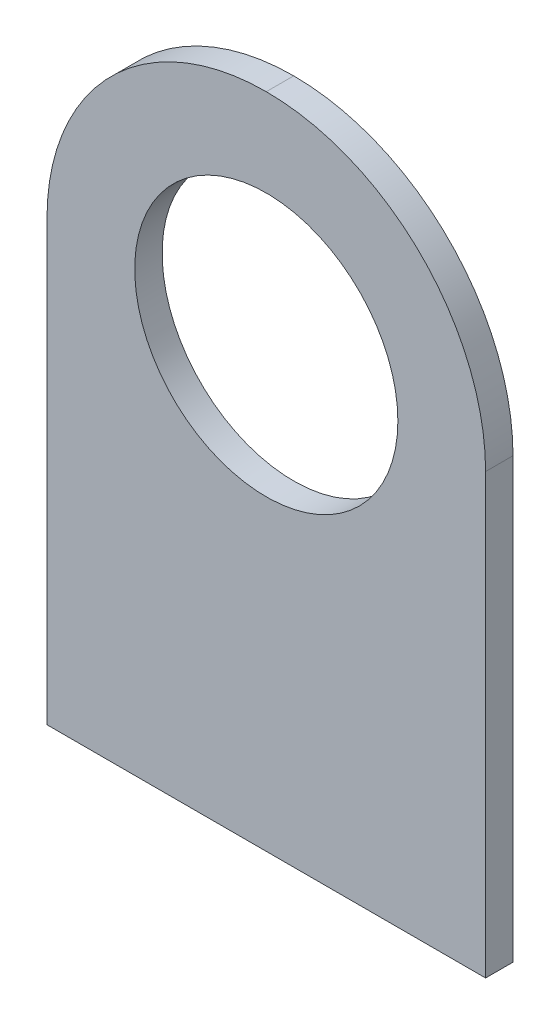
ISO-10303-21;
HEADER;
FILE_DESCRIPTION(('STEP AP214'),'2;1');
FILE_NAME('part.step','',(''),(''),'','','');
FILE_SCHEMA(('AUTOMOTIVE_DESIGN { 1 0 10303 214 1 1 1 1 }'));
ENDSEC;
DATA;
#1=APPLICATION_CONTEXT('core data for automotive mechanical design processes');
#2=APPLICATION_PROTOCOL_DEFINITION('international standard','automotive_design',2000,#1);
#3=PRODUCT_CONTEXT('',#1,'mechanical');
#4=PRODUCT('Part','Part','',(#3));
#5=PRODUCT_RELATED_PRODUCT_CATEGORY('part','',(#4));
#6=PRODUCT_DEFINITION_FORMATION('','',#4);
#7=PRODUCT_DEFINITION_CONTEXT('part definition',#1,'design');
#8=PRODUCT_DEFINITION('design','',#6,#7);
#9=PRODUCT_DEFINITION_SHAPE('','',#8);
#10=(LENGTH_UNIT() NAMED_UNIT(*) SI_UNIT(.MILLI.,.METRE.));
#11=(NAMED_UNIT(*) PLANE_ANGLE_UNIT() SI_UNIT($,.RADIAN.));
#12=(NAMED_UNIT(*) SI_UNIT($,.STERADIAN.) SOLID_ANGLE_UNIT());
#13=UNCERTAINTY_MEASURE_WITH_UNIT(LENGTH_MEASURE(1.E-05),#10,'distance_accuracy_value','');
#14=(GEOMETRIC_REPRESENTATION_CONTEXT(3) GLOBAL_UNCERTAINTY_ASSIGNED_CONTEXT((#13)) GLOBAL_UNIT_ASSIGNED_CONTEXT((#10,
#11,#12)) REPRESENTATION_CONTEXT('',''));
#15=CARTESIAN_POINT('',(0.,0.,0.));
#16=DIRECTION('',(0.,0.,1.));
#17=DIRECTION('',(1.,0.,0.));
#18=AXIS2_PLACEMENT_3D('',#15,#16,#17);
#19=CARTESIAN_POINT('',(0.,0.,3.175));
#20=DIRECTION('',(0.,0.,1.));
#21=DIRECTION('',(1.,0.,0.));
#22=AXIS2_PLACEMENT_3D('',#19,#20,#21);
#23=PLANE('',#22);
#24=CARTESIAN_POINT('',(-76.9257142857142,-28.2302857142857,3.175));
#25=DIRECTION('',(0.,0.,1.));
#26=DIRECTION('',(1.,0.,0.));
#27=AXIS2_PLACEMENT_3D('',#24,#25,#26);
#28=CIRCLE('',#27,25.4);
#29=CARTESIAN_POINT('',(-51.5257142857142,-28.2302857142857,3.175));
#30=VERTEX_POINT('',#29);
#31=CARTESIAN_POINT('',(-76.9257142857142,-2.83028571428573,3.175));
#32=VERTEX_POINT('',#31);
#33=EDGE_CURVE('E49',#30,#32,#28,.T.);
#34=ORIENTED_EDGE('',*,*,#33,.T.);
#35=CARTESIAN_POINT('',(-76.9257142857142,-28.2302857142857,3.175));
#36=DIRECTION('',(0.,0.,1.));
#37=DIRECTION('',(1.,0.,0.));
#38=AXIS2_PLACEMENT_3D('',#35,#36,#37);
#39=CIRCLE('',#38,25.4);
#40=CARTESIAN_POINT('',(-102.325714285714,-28.2302857142857,3.175));
#41=VERTEX_POINT('',#40);
#42=EDGE_CURVE('E42',#32,#41,#39,.T.);
#43=ORIENTED_EDGE('',*,*,#42,.T.);
#44=DIRECTION('',(0.,-1.,0.));
#45=VECTOR('',#44,1.);
#46=CARTESIAN_POINT('',(-102.325714285714,-2.83028571428573,3.175));
#47=LINE('',#46,#45);
#48=CARTESIAN_POINT('',(-102.325714285714,-79.0302857142857,3.175));
#49=VERTEX_POINT('',#48);
#50=EDGE_CURVE('E79',#41,#49,#47,.T.);
#51=ORIENTED_EDGE('',*,*,#50,.T.);
#52=DIRECTION('',(1.,0.,0.));
#53=VECTOR('',#52,1.);
#54=CARTESIAN_POINT('',(-102.325714285714,-79.0302857142857,3.175));
#55=LINE('',#54,#53);
#56=CARTESIAN_POINT('',(-51.5257142857142,-79.0302857142857,3.175));
#57=VERTEX_POINT('',#56);
#58=EDGE_CURVE('E82',#49,#57,#55,.T.);
#59=ORIENTED_EDGE('',*,*,#58,.T.);
#60=DIRECTION('',(0.,1.,0.));
#61=VECTOR('',#60,1.);
#62=CARTESIAN_POINT('',(-51.5257142857142,-2.83028571428573,3.175));
#63=LINE('',#62,#61);
#64=EDGE_CURVE('E97',#57,#30,#63,.T.);
#65=ORIENTED_EDGE('',*,*,#64,.T.);
#66=EDGE_LOOP('',(#34,#43,#51,#59,#65));
#67=FACE_BOUND('',#66,.T.);
#68=CARTESIAN_POINT('',(-76.9257142857142,-28.2302857142857,3.175));
#69=DIRECTION('',(0.,0.,1.));
#70=DIRECTION('',(1.,0.,0.));
#71=AXIS2_PLACEMENT_3D('',#68,#69,#70);
#72=CIRCLE('',#71,15.24);
#73=CARTESIAN_POINT('',(-61.6857142857143,-28.2302857142857,3.175));
#74=VERTEX_POINT('',#73);
#75=EDGE_CURVE('E125',#74,#74,#72,.T.);
#76=ORIENTED_EDGE('',*,*,#75,.F.);
#77=EDGE_LOOP('',(#76));
#78=FACE_BOUND('',#77,.T.);
#79=ADVANCED_FACE('F33',(#67,#78),#23,.T.);
#80=CARTESIAN_POINT('',(0.,0.,0.));
#81=DIRECTION('',(0.,0.,1.));
#82=DIRECTION('',(1.,0.,0.));
#83=AXIS2_PLACEMENT_3D('',#80,#81,#82);
#84=PLANE('',#83);
#85=DIRECTION('',(0.,-1.,0.));
#86=VECTOR('',#85,1.);
#87=CARTESIAN_POINT('',(-102.325714285714,-2.83028571428573,0.));
#88=LINE('',#87,#86);
#89=CARTESIAN_POINT('',(-102.325714285714,-28.2302857142857,0.));
#90=VERTEX_POINT('',#89);
#91=CARTESIAN_POINT('',(-102.325714285714,-79.0302857142857,0.));
#92=VERTEX_POINT('',#91);
#93=EDGE_CURVE('E101',#90,#92,#88,.T.);
#94=ORIENTED_EDGE('',*,*,#93,.F.);
#95=CARTESIAN_POINT('',(-76.9257142857142,-28.2302857142857,0.));
#96=DIRECTION('',(0.,0.,1.));
#97=DIRECTION('',(1.,0.,0.));
#98=AXIS2_PLACEMENT_3D('',#95,#96,#97);
#99=CIRCLE('',#98,25.4);
#100=CARTESIAN_POINT('',(-76.9257142857142,-2.83028571428573,0.));
#101=VERTEX_POINT('',#100);
#102=EDGE_CURVE('E111',#90,#101,#99,.F.);
#103=ORIENTED_EDGE('',*,*,#102,.T.);
#104=CARTESIAN_POINT('',(-76.9257142857142,-28.2302857142857,0.));
#105=DIRECTION('',(0.,0.,1.));
#106=DIRECTION('',(1.,0.,0.));
#107=AXIS2_PLACEMENT_3D('',#104,#105,#106);
#108=CIRCLE('',#107,25.4);
#109=CARTESIAN_POINT('',(-51.5257142857142,-28.2302857142857,0.));
#110=VERTEX_POINT('',#109);
#111=EDGE_CURVE('E105',#101,#110,#108,.F.);
#112=ORIENTED_EDGE('',*,*,#111,.T.);
#113=DIRECTION('',(0.,1.,0.));
#114=VECTOR('',#113,1.);
#115=CARTESIAN_POINT('',(-51.5257142857142,-2.83028571428573,0.));
#116=LINE('',#115,#114);
#117=CARTESIAN_POINT('',(-51.5257142857142,-79.0302857142857,0.));
#118=VERTEX_POINT('',#117);
#119=EDGE_CURVE('E89',#118,#110,#116,.T.);
#120=ORIENTED_EDGE('',*,*,#119,.F.);
#121=DIRECTION('',(1.,0.,0.));
#122=VECTOR('',#121,1.);
#123=CARTESIAN_POINT('',(-102.325714285714,-79.0302857142857,0.));
#124=LINE('',#123,#122);
#125=EDGE_CURVE('E133',#92,#118,#124,.T.);
#126=ORIENTED_EDGE('',*,*,#125,.F.);
#127=EDGE_LOOP('',(#94,#103,#112,#120,#126));
#128=FACE_BOUND('',#127,.T.);
#129=CARTESIAN_POINT('',(-76.9257142857142,-28.2302857142857,0.));
#130=DIRECTION('',(0.,0.,1.));
#131=DIRECTION('',(1.,0.,0.));
#132=AXIS2_PLACEMENT_3D('',#129,#130,#131);
#133=CIRCLE('',#132,15.24);
#134=CARTESIAN_POINT('',(-61.6857142857143,-28.2302857142857,0.));
#135=VERTEX_POINT('',#134);
#136=EDGE_CURVE('E123',#135,#135,#133,.T.);
#137=ORIENTED_EDGE('',*,*,#136,.T.);
#138=EDGE_LOOP('',(#137));
#139=FACE_BOUND('',#138,.T.);
#140=ADVANCED_FACE('F116',(#128,#139),#84,.F.);
#141=CARTESIAN_POINT('',(-102.325714285714,-2.83028571428573,3.175));
#142=DIRECTION('',(1.,0.,0.));
#143=DIRECTION('',(0.,1.,0.));
#144=AXIS2_PLACEMENT_3D('',#141,#142,#143);
#145=PLANE('',#144);
#146=ORIENTED_EDGE('',*,*,#50,.F.);
#147=DIRECTION('',(0.,0.,-1.));
#148=VECTOR('',#147,1.);
#149=CARTESIAN_POINT('',(-102.325714285714,-28.2302857142857,3.175));
#150=LINE('',#149,#148);
#151=EDGE_CURVE('E103',#41,#90,#150,.T.);
#152=ORIENTED_EDGE('',*,*,#151,.T.);
#153=ORIENTED_EDGE('',*,*,#93,.T.);
#154=DIRECTION('',(0.,0.,-1.));
#155=VECTOR('',#154,1.);
#156=CARTESIAN_POINT('',(-102.325714285714,-79.0302857142857,3.175));
#157=LINE('',#156,#155);
#158=EDGE_CURVE('E94',#49,#92,#157,.T.);
#159=ORIENTED_EDGE('',*,*,#158,.F.);
#160=EDGE_LOOP('',(#146,#152,#153,#159));
#161=FACE_BOUND('',#160,.T.);
#162=ADVANCED_FACE('F99',(#161),#145,.F.);
#163=CARTESIAN_POINT('',(-102.325714285714,-79.0302857142857,3.175));
#164=DIRECTION('',(0.,1.,0.));
#165=DIRECTION('',(0.,0.,1.));
#166=AXIS2_PLACEMENT_3D('',#163,#164,#165);
#167=PLANE('',#166);
#168=ORIENTED_EDGE('',*,*,#125,.T.);
#169=DIRECTION('',(0.,0.,-1.));
#170=VECTOR('',#169,1.);
#171=CARTESIAN_POINT('',(-51.5257142857142,-79.0302857142857,3.175));
#172=LINE('',#171,#170);
#173=EDGE_CURVE('E96',#57,#118,#172,.T.);
#174=ORIENTED_EDGE('',*,*,#173,.F.);
#175=ORIENTED_EDGE('',*,*,#58,.F.);
#176=ORIENTED_EDGE('',*,*,#158,.T.);
#177=EDGE_LOOP('',(#168,#174,#175,#176));
#178=FACE_BOUND('',#177,.T.);
#179=ADVANCED_FACE('F93',(#178),#167,.F.);
#180=CARTESIAN_POINT('',(-51.5257142857142,-2.83028571428573,3.175));
#181=DIRECTION('',(-1.,0.,0.));
#182=DIRECTION('',(0.,-1.,0.));
#183=AXIS2_PLACEMENT_3D('',#180,#181,#182);
#184=PLANE('',#183);
#185=ORIENTED_EDGE('',*,*,#119,.T.);
#186=DIRECTION('',(0.,0.,-1.));
#187=VECTOR('',#186,1.);
#188=CARTESIAN_POINT('',(-51.5257142857142,-28.2302857142857,3.175));
#189=LINE('',#188,#187);
#190=EDGE_CURVE('E11',#110,#30,#189,.F.);
#191=ORIENTED_EDGE('',*,*,#190,.T.);
#192=ORIENTED_EDGE('',*,*,#64,.F.);
#193=ORIENTED_EDGE('',*,*,#173,.T.);
#194=EDGE_LOOP('',(#185,#191,#192,#193));
#195=FACE_BOUND('',#194,.T.);
#196=ADVANCED_FACE('F134',(#195),#184,.F.);
#197=CARTESIAN_POINT('',(-76.9257142857142,-28.2302857142857,3.175));
#198=DIRECTION('',(0.,0.,-1.));
#199=DIRECTION('',(-1.,0.,0.));
#200=AXIS2_PLACEMENT_3D('',#197,#198,#199);
#201=CYLINDRICAL_SURFACE('',#200,15.24);
#202=ORIENTED_EDGE('',*,*,#75,.T.);
#203=EDGE_LOOP('',(#202));
#204=FACE_BOUND('',#203,.T.);
#205=ORIENTED_EDGE('',*,*,#136,.F.);
#206=EDGE_LOOP('',(#205));
#207=FACE_BOUND('',#206,.T.);
#208=ADVANCED_FACE('F136',(#204,#207),#201,.F.);
#209=CARTESIAN_POINT('',(-76.9257142857142,-28.2302857142857,3.175));
#210=DIRECTION('',(0.,0.,-1.));
#211=DIRECTION('',(-1.,0.,0.));
#212=AXIS2_PLACEMENT_3D('',#209,#210,#211);
#213=CYLINDRICAL_SURFACE('',#212,25.4);
#214=DIRECTION('',(0.,0.,-1.));
#215=VECTOR('',#214,1.);
#216=CARTESIAN_POINT('',(-76.9257142857142,-2.83028571428573,3.175));
#217=LINE('',#216,#215);
#218=EDGE_CURVE('E37',#32,#101,#217,.T.);
#219=ORIENTED_EDGE('',*,*,#218,.F.);
#220=ORIENTED_EDGE('',*,*,#33,.F.);
#221=ORIENTED_EDGE('',*,*,#190,.F.);
#222=ORIENTED_EDGE('',*,*,#111,.F.);
#223=EDGE_LOOP('',(#219,#220,#221,#222));
#224=FACE_BOUND('',#223,.T.);
#225=ADVANCED_FACE('F35',(#224),#213,.T.);
#226=CARTESIAN_POINT('',(-76.9257142857142,-28.2302857142857,3.175));
#227=DIRECTION('',(0.,0.,-1.));
#228=DIRECTION('',(-1.,0.,0.));
#229=AXIS2_PLACEMENT_3D('',#226,#227,#228);
#230=CYLINDRICAL_SURFACE('',#229,25.4);
#231=ORIENTED_EDGE('',*,*,#42,.F.);
#232=ORIENTED_EDGE('',*,*,#218,.T.);
#233=ORIENTED_EDGE('',*,*,#102,.F.);
#234=ORIENTED_EDGE('',*,*,#151,.F.);
#235=EDGE_LOOP('',(#231,#232,#233,#234));
#236=FACE_BOUND('',#235,.T.);
#237=ADVANCED_FACE('F122',(#236),#230,.T.);
#238=CLOSED_SHELL('',(#79,#140,#162,#179,#196,#208,#225,#237));
#239=MANIFOLD_SOLID_BREP('B2',#238);
#240=ADVANCED_BREP_SHAPE_REPRESENTATION('',(#18,#239),#14);
#241=SHAPE_DEFINITION_REPRESENTATION(#9,#240);
ENDSEC;
END-ISO-10303-21;
